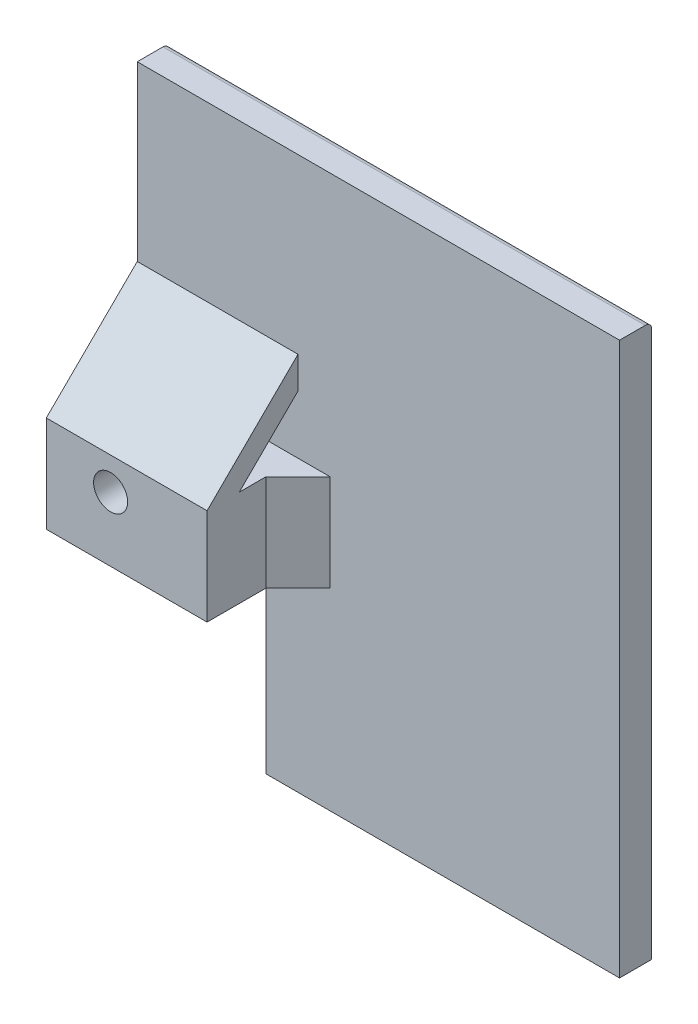
ISO-10303-21;
HEADER;
FILE_DESCRIPTION(('STEP AP214'),'2;1');
FILE_NAME('part.step','',(''),(''),'','','');
FILE_SCHEMA(('AUTOMOTIVE_DESIGN { 1 0 10303 214 1 1 1 1 }'));
ENDSEC;
DATA;
#1=APPLICATION_CONTEXT('core data for automotive mechanical design processes');
#2=APPLICATION_PROTOCOL_DEFINITION('international standard','automotive_design',2000,#1);
#3=PRODUCT_CONTEXT('',#1,'mechanical');
#4=PRODUCT('Part','Part','',(#3));
#5=PRODUCT_RELATED_PRODUCT_CATEGORY('part','',(#4));
#6=PRODUCT_DEFINITION_FORMATION('','',#4);
#7=PRODUCT_DEFINITION_CONTEXT('part definition',#1,'design');
#8=PRODUCT_DEFINITION('design','',#6,#7);
#9=PRODUCT_DEFINITION_SHAPE('','',#8);
#10=(LENGTH_UNIT() NAMED_UNIT(*) SI_UNIT(.MILLI.,.METRE.));
#11=(NAMED_UNIT(*) PLANE_ANGLE_UNIT() SI_UNIT($,.RADIAN.));
#12=(NAMED_UNIT(*) SI_UNIT($,.STERADIAN.) SOLID_ANGLE_UNIT());
#13=UNCERTAINTY_MEASURE_WITH_UNIT(LENGTH_MEASURE(1.E-05),#10,'distance_accuracy_value','');
#14=(GEOMETRIC_REPRESENTATION_CONTEXT(3) GLOBAL_UNCERTAINTY_ASSIGNED_CONTEXT((#13)) GLOBAL_UNIT_ASSIGNED_CONTEXT((#10,
#11,#12)) REPRESENTATION_CONTEXT('',''));
#15=CARTESIAN_POINT('',(0.,0.,0.));
#16=DIRECTION('',(0.,0.,1.));
#17=DIRECTION('',(1.,0.,0.));
#18=AXIS2_PLACEMENT_3D('',#15,#16,#17);
#19=CARTESIAN_POINT('',(0.,0.,5.));
#20=DIRECTION('',(0.,1.,0.));
#21=DIRECTION('',(0.,0.,1.));
#22=AXIS2_PLACEMENT_3D('',#19,#20,#21);
#23=PLANE('',#22);
#24=DIRECTION('',(-1.,0.,0.));
#25=VECTOR('',#24,1.);
#26=CARTESIAN_POINT('',(75.,0.,-9.14213562373095));
#27=LINE('',#26,#25);
#28=CARTESIAN_POINT('',(30.0000000000001,0.,-9.14213562373095));
#29=VERTEX_POINT('',#28);
#30=CARTESIAN_POINT('',(20.,0.,-9.14213562373096));
#31=VERTEX_POINT('',#30);
#32=EDGE_CURVE('E11',#29,#31,#27,.T.);
#33=ORIENTED_EDGE('',*,*,#32,.F.);
#34=DIRECTION('',(-0.707106781186552,0.,0.707106781186543));
#35=VECTOR('',#34,1.);
#36=CARTESIAN_POINT('',(7.92893218813437,0.,12.9289321881345));
#37=LINE('',#36,#35);
#38=CARTESIAN_POINT('',(25.,0.,-4.14213562373097));
#39=VERTEX_POINT('',#38);
#40=EDGE_CURVE('E279',#29,#39,#37,.T.);
#41=ORIENTED_EDGE('',*,*,#40,.T.);
#42=DIRECTION('',(0.,0.,-1.));
#43=VECTOR('',#42,1.);
#44=CARTESIAN_POINT('',(25.,0.,5.));
#45=LINE('',#44,#43);
#46=CARTESIAN_POINT('',(25.,0.,5.));
#47=VERTEX_POINT('',#46);
#48=EDGE_CURVE('E268',#47,#39,#45,.T.);
#49=ORIENTED_EDGE('',*,*,#48,.F.);
#50=DIRECTION('',(1.,0.,0.));
#51=VECTOR('',#50,1.);
#52=CARTESIAN_POINT('',(0.,0.,5.));
#53=LINE('',#52,#51);
#54=CARTESIAN_POINT('',(0.,0.,5.));
#55=VERTEX_POINT('',#54);
#56=EDGE_CURVE('E242',#55,#47,#53,.T.);
#57=ORIENTED_EDGE('',*,*,#56,.F.);
#58=DIRECTION('',(0.,0.,-1.));
#59=VECTOR('',#58,1.);
#60=CARTESIAN_POINT('',(0.,0.,5.));
#61=LINE('',#60,#59);
#62=CARTESIAN_POINT('',(0.,0.,0.));
#63=VERTEX_POINT('',#62);
#64=EDGE_CURVE('E254',#55,#63,#61,.T.);
#65=ORIENTED_EDGE('',*,*,#64,.T.);
#66=DIRECTION('',(1.,0.,0.));
#67=VECTOR('',#66,1.);
#68=CARTESIAN_POINT('',(0.,0.,0.));
#69=LINE('',#68,#67);
#70=CARTESIAN_POINT('',(20.,0.,0.));
#71=VERTEX_POINT('',#70);
#72=EDGE_CURVE('E257',#63,#71,#69,.T.);
#73=ORIENTED_EDGE('',*,*,#72,.T.);
#74=DIRECTION('',(0.,0.,1.));
#75=VECTOR('',#74,1.);
#76=CARTESIAN_POINT('',(20.,0.,-14.142135623731));
#77=LINE('',#76,#75);
#78=EDGE_CURVE('E236',#31,#71,#77,.T.);
#79=ORIENTED_EDGE('',*,*,#78,.F.);
#80=EDGE_LOOP('',(#33,#41,#49,#57,#65,#73,#79));
#81=FACE_BOUND('',#80,.T.);
#82=ADVANCED_FACE('F45',(#81),#23,.F.);
#83=CARTESIAN_POINT('',(0.,0.,0.));
#84=DIRECTION('',(0.,0.,1.));
#85=DIRECTION('',(1.,0.,0.));
#86=AXIS2_PLACEMENT_3D('',#83,#84,#85);
#87=PLANE('',#86);
#88=CARTESIAN_POINT('',(10.,10.,0.));
#89=DIRECTION('',(0.,0.,1.));
#90=DIRECTION('',(1.,0.,0.));
#91=AXIS2_PLACEMENT_3D('',#88,#89,#90);
#92=CIRCLE('',#91,2.65);
#93=CARTESIAN_POINT('',(12.65,10.,0.));
#94=VERTEX_POINT('',#93);
#95=EDGE_CURVE('E238',#94,#94,#92,.T.);
#96=ORIENTED_EDGE('',*,*,#95,.T.);
#97=EDGE_LOOP('',(#96));
#98=FACE_BOUND('',#97,.T.);
#99=DIRECTION('',(0.,1.,0.));
#100=VECTOR('',#99,1.);
#101=CARTESIAN_POINT('',(20.,15.,0.));
#102=LINE('',#101,#100);
#103=CARTESIAN_POINT('',(20.,15.,0.));
#104=VERTEX_POINT('',#103);
#105=EDGE_CURVE('E166',#71,#104,#102,.T.);
#106=ORIENTED_EDGE('',*,*,#105,.F.);
#107=ORIENTED_EDGE('',*,*,#72,.F.);
#108=DIRECTION('',(0.,1.,0.));
#109=VECTOR('',#108,1.);
#110=CARTESIAN_POINT('',(0.,0.,0.));
#111=LINE('',#110,#109);
#112=CARTESIAN_POINT('',(0.,15.,0.));
#113=VERTEX_POINT('',#112);
#114=EDGE_CURVE('E243',#63,#113,#111,.T.);
#115=ORIENTED_EDGE('',*,*,#114,.T.);
#116=DIRECTION('',(1.,0.,0.));
#117=VECTOR('',#116,1.);
#118=CARTESIAN_POINT('',(0.,15.,0.));
#119=LINE('',#118,#117);
#120=EDGE_CURVE('E260',#113,#104,#119,.T.);
#121=ORIENTED_EDGE('',*,*,#120,.T.);
#122=EDGE_LOOP('',(#106,#107,#115,#121));
#123=FACE_BOUND('',#122,.T.);
#124=ADVANCED_FACE('F303',(#98,#123),#87,.F.);
#125=CARTESIAN_POINT('',(25.,0.,5.));
#126=DIRECTION('',(1.,0.,0.));
#127=DIRECTION('',(0.,1.,0.));
#128=AXIS2_PLACEMENT_3D('',#125,#126,#127);
#129=PLANE('',#128);
#130=ORIENTED_EDGE('',*,*,#48,.T.);
#131=DIRECTION('',(0.,1.,0.));
#132=VECTOR('',#131,1.);
#133=CARTESIAN_POINT('',(25.,0.,-4.14213562373097));
#134=LINE('',#133,#132);
#135=CARTESIAN_POINT('',(25.,15.,-4.14213562373096));
#136=VERTEX_POINT('',#135);
#137=EDGE_CURVE('E277',#39,#136,#134,.T.);
#138=ORIENTED_EDGE('',*,*,#137,.T.);
#139=DIRECTION('',(0.,0.,-1.));
#140=VECTOR('',#139,1.);
#141=CARTESIAN_POINT('',(25.,15.,5.));
#142=LINE('',#141,#140);
#143=CARTESIAN_POINT('',(25.,15.,0.));
#144=VERTEX_POINT('',#143);
#145=EDGE_CURVE('E265',#144,#136,#142,.T.);
#146=ORIENTED_EDGE('',*,*,#145,.F.);
#147=DIRECTION('',(0.,-0.703526470681449,0.710669054518701));
#148=VECTOR('',#147,1.);
#149=CARTESIAN_POINT('',(25.,15.,0.));
#150=LINE('',#149,#148);
#151=CARTESIAN_POINT('',(25.,24.0502525316942,-9.14213562373095));
#152=VERTEX_POINT('',#151);
#153=EDGE_CURVE('E197',#152,#144,#150,.T.);
#154=ORIENTED_EDGE('',*,*,#153,.F.);
#155=DIRECTION('',(0.,-1.,0.));
#156=VECTOR('',#155,1.);
#157=CARTESIAN_POINT('',(25.,15.,-9.14213562373095));
#158=LINE('',#157,#156);
#159=CARTESIAN_POINT('',(25.,29.,-9.14213562373095));
#160=VERTEX_POINT('',#159);
#161=EDGE_CURVE('E271',#160,#152,#158,.T.);
#162=ORIENTED_EDGE('',*,*,#161,.F.);
#163=DIRECTION('',(0.,0.703526470681449,-0.710669054518701));
#164=VECTOR('',#163,1.);
#165=CARTESIAN_POINT('',(25.,29.,-9.14213562373095));
#166=LINE('',#165,#164);
#167=CARTESIAN_POINT('',(25.,15.,5.));
#168=VERTEX_POINT('',#167);
#169=EDGE_CURVE('E192',#168,#160,#166,.T.);
#170=ORIENTED_EDGE('',*,*,#169,.F.);
#171=DIRECTION('',(0.,-1.,0.));
#172=VECTOR('',#171,1.);
#173=CARTESIAN_POINT('',(25.,0.,5.));
#174=LINE('',#173,#172);
#175=EDGE_CURVE('E245',#168,#47,#174,.T.);
#176=ORIENTED_EDGE('',*,*,#175,.T.);
#177=EDGE_LOOP('',(#130,#138,#146,#154,#162,#170,#176));
#178=FACE_BOUND('',#177,.T.);
#179=ADVANCED_FACE('F309',(#178),#129,.T.);
#180=CARTESIAN_POINT('',(0.,15.,5.));
#181=DIRECTION('',(0.,1.,0.));
#182=DIRECTION('',(0.,0.,1.));
#183=AXIS2_PLACEMENT_3D('',#180,#181,#182);
#184=PLANE('',#183);
#185=DIRECTION('',(-1.,0.,0.));
#186=VECTOR('',#185,1.);
#187=CARTESIAN_POINT('',(48.7154244372162,15.,0.));
#188=LINE('',#187,#186);
#189=EDGE_CURVE('E200',#144,#104,#188,.T.);
#190=ORIENTED_EDGE('',*,*,#189,.F.);
#191=ORIENTED_EDGE('',*,*,#145,.T.);
#192=DIRECTION('',(0.707106781186552,0.,-0.707106781186543));
#193=VECTOR('',#192,1.);
#194=CARTESIAN_POINT('',(30.,15.,-9.14213562373095));
#195=LINE('',#194,#193);
#196=CARTESIAN_POINT('',(30.,15.,-9.14213562373095));
#197=VERTEX_POINT('',#196);
#198=EDGE_CURVE('E281',#136,#197,#195,.T.);
#199=ORIENTED_EDGE('',*,*,#198,.T.);
#200=DIRECTION('',(1.,0.,0.));
#201=VECTOR('',#200,1.);
#202=CARTESIAN_POINT('',(20.,15.,-9.14213562373095));
#203=LINE('',#202,#201);
#204=CARTESIAN_POINT('',(20.,15.,-9.14213562373095));
#205=VERTEX_POINT('',#204);
#206=EDGE_CURVE('E221',#205,#197,#203,.T.);
#207=ORIENTED_EDGE('',*,*,#206,.F.);
#208=DIRECTION('',(0.,0.,1.));
#209=VECTOR('',#208,1.);
#210=CARTESIAN_POINT('',(20.,15.,-14.142135623731));
#211=LINE('',#210,#209);
#212=EDGE_CURVE('E232',#205,#104,#211,.T.);
#213=ORIENTED_EDGE('',*,*,#212,.T.);
#214=EDGE_LOOP('',(#190,#191,#199,#207,#213));
#215=FACE_BOUND('',#214,.T.);
#216=ADVANCED_FACE('F318',(#215),#184,.T.);
#217=CARTESIAN_POINT('',(10.,10.,5.));
#218=DIRECTION('',(0.,0.,-1.));
#219=DIRECTION('',(-1.,0.,0.));
#220=AXIS2_PLACEMENT_3D('',#217,#218,#219);
#221=CYLINDRICAL_SURFACE('',#220,2.65);
#222=CARTESIAN_POINT('',(10.,10.,5.));
#223=DIRECTION('',(0.,0.,1.));
#224=DIRECTION('',(1.,0.,0.));
#225=AXIS2_PLACEMENT_3D('',#222,#223,#224);
#226=CIRCLE('',#225,2.65);
#227=CARTESIAN_POINT('',(12.65,10.,5.));
#228=VERTEX_POINT('',#227);
#229=EDGE_CURVE('E239',#228,#228,#226,.T.);
#230=ORIENTED_EDGE('',*,*,#229,.T.);
#231=EDGE_LOOP('',(#230));
#232=FACE_BOUND('',#231,.T.);
#233=ORIENTED_EDGE('',*,*,#95,.F.);
#234=EDGE_LOOP('',(#233));
#235=FACE_BOUND('',#234,.T.);
#236=ADVANCED_FACE('F315',(#232,#235),#221,.F.);
#237=CARTESIAN_POINT('',(0.,0.,5.));
#238=DIRECTION('',(-1.,0.,0.));
#239=DIRECTION('',(0.,-1.,0.));
#240=AXIS2_PLACEMENT_3D('',#237,#238,#239);
#241=PLANE('',#240);
#242=DIRECTION('',(0.,0.,-1.));
#243=VECTOR('',#242,1.);
#244=CARTESIAN_POINT('',(0.,55.9,-9.14213562373095));
#245=LINE('',#244,#243);
#246=CARTESIAN_POINT('',(0.,55.9,-9.14213562373095));
#247=VERTEX_POINT('',#246);
#248=CARTESIAN_POINT('',(0.,55.9,-13.142135623731));
#249=VERTEX_POINT('',#248);
#250=EDGE_CURVE('E216',#247,#249,#245,.T.);
#251=ORIENTED_EDGE('',*,*,#250,.T.);
#252=CARTESIAN_POINT('',(0.,54.9,-13.142135623731));
#253=DIRECTION('',(-1.,0.,0.));
#254=DIRECTION('',(0.,-1.,0.));
#255=AXIS2_PLACEMENT_3D('',#252,#253,#254);
#256=CIRCLE('',#255,1.);
#257=CARTESIAN_POINT('',(0.,54.9,-14.142135623731));
#258=VERTEX_POINT('',#257);
#259=EDGE_CURVE('E69',#249,#258,#256,.T.);
#260=ORIENTED_EDGE('',*,*,#259,.T.);
#261=DIRECTION('',(0.,1.,0.));
#262=VECTOR('',#261,1.);
#263=CARTESIAN_POINT('',(0.,29.,-14.142135623731));
#264=LINE('',#263,#262);
#265=CARTESIAN_POINT('',(0.,29.,-14.142135623731));
#266=VERTEX_POINT('',#265);
#267=EDGE_CURVE('E213',#266,#258,#264,.T.);
#268=ORIENTED_EDGE('',*,*,#267,.F.);
#269=DIRECTION('',(0.,-0.703526470681449,0.710669054518701));
#270=VECTOR('',#269,1.);
#271=CARTESIAN_POINT('',(0.,15.,0.));
#272=LINE('',#271,#270);
#273=EDGE_CURVE('E189',#266,#113,#272,.T.);
#274=ORIENTED_EDGE('',*,*,#273,.T.);
#275=ORIENTED_EDGE('',*,*,#114,.F.);
#276=ORIENTED_EDGE('',*,*,#64,.F.);
#277=DIRECTION('',(0.,1.,0.));
#278=VECTOR('',#277,1.);
#279=CARTESIAN_POINT('',(0.,0.,5.));
#280=LINE('',#279,#278);
#281=CARTESIAN_POINT('',(0.,15.,5.));
#282=VERTEX_POINT('',#281);
#283=EDGE_CURVE('E251',#55,#282,#280,.T.);
#284=ORIENTED_EDGE('',*,*,#283,.T.);
#285=DIRECTION('',(0.,0.703526470681449,-0.710669054518701));
#286=VECTOR('',#285,1.);
#287=CARTESIAN_POINT('',(0.,29.,-9.14213562373095));
#288=LINE('',#287,#286);
#289=CARTESIAN_POINT('',(0.,29.,-9.14213562373095));
#290=VERTEX_POINT('',#289);
#291=EDGE_CURVE('E188',#282,#290,#288,.T.);
#292=ORIENTED_EDGE('',*,*,#291,.T.);
#293=DIRECTION('',(0.,1.,0.));
#294=VECTOR('',#293,1.);
#295=CARTESIAN_POINT('',(0.,29.,-9.14213562373095));
#296=LINE('',#295,#294);
#297=EDGE_CURVE('E212',#290,#247,#296,.T.);
#298=ORIENTED_EDGE('',*,*,#297,.T.);
#299=EDGE_LOOP('',(#251,#260,#268,#274,#275,#276,#284,#292,#298));
#300=FACE_BOUND('',#299,.T.);
#301=ADVANCED_FACE('F317',(#300),#241,.T.);
#302=CARTESIAN_POINT('',(0.,0.,5.));
#303=DIRECTION('',(0.,0.,1.));
#304=DIRECTION('',(1.,0.,0.));
#305=AXIS2_PLACEMENT_3D('',#302,#303,#304);
#306=PLANE('',#305);
#307=ORIENTED_EDGE('',*,*,#229,.F.);
#308=EDGE_LOOP('',(#307));
#309=FACE_BOUND('',#308,.T.);
#310=ORIENTED_EDGE('',*,*,#56,.T.);
#311=ORIENTED_EDGE('',*,*,#175,.F.);
#312=DIRECTION('',(1.,0.,0.));
#313=VECTOR('',#312,1.);
#314=CARTESIAN_POINT('',(0.,15.,5.));
#315=LINE('',#314,#313);
#316=EDGE_CURVE('E248',#282,#168,#315,.T.);
#317=ORIENTED_EDGE('',*,*,#316,.F.);
#318=ORIENTED_EDGE('',*,*,#283,.F.);
#319=EDGE_LOOP('',(#310,#311,#317,#318));
#320=FACE_BOUND('',#319,.T.);
#321=ADVANCED_FACE('F327',(#309,#320),#306,.T.);
#322=CARTESIAN_POINT('',(20.,15.,-14.142135623731));
#323=DIRECTION('',(1.,0.,0.));
#324=DIRECTION('',(0.,0.,-1.));
#325=AXIS2_PLACEMENT_3D('',#322,#323,#324);
#326=PLANE('',#325);
#327=DIRECTION('',(0.,-1.,0.));
#328=VECTOR('',#327,1.);
#329=CARTESIAN_POINT('',(20.,55.9,-9.14213562373095));
#330=LINE('',#329,#328);
#331=CARTESIAN_POINT('',(20.,24.0502525316942,-9.14213562373095));
#332=VERTEX_POINT('',#331);
#333=EDGE_CURVE('E225',#332,#205,#330,.T.);
#334=ORIENTED_EDGE('',*,*,#333,.F.);
#335=DIRECTION('',(0.,0.703526470681449,-0.710669054518701));
#336=VECTOR('',#335,1.);
#337=CARTESIAN_POINT('',(20.,22.0707070707071,-7.14249273925805));
#338=LINE('',#337,#336);
#339=CARTESIAN_POINT('',(20.,29.,-14.142135623731));
#340=VERTEX_POINT('',#339);
#341=EDGE_CURVE('E206',#332,#340,#338,.T.);
#342=ORIENTED_EDGE('',*,*,#341,.T.);
#343=DIRECTION('',(0.,1.,0.));
#344=VECTOR('',#343,1.);
#345=CARTESIAN_POINT('',(20.,15.,-14.142135623731));
#346=LINE('',#345,#344);
#347=CARTESIAN_POINT('',(20.,-30.,-14.142135623731));
#348=VERTEX_POINT('',#347);
#349=EDGE_CURVE('E229',#348,#340,#346,.T.);
#350=ORIENTED_EDGE('',*,*,#349,.F.);
#351=DIRECTION('',(0.,0.,-1.));
#352=VECTOR('',#351,1.);
#353=CARTESIAN_POINT('',(20.,-30.,-14.142135623731));
#354=LINE('',#353,#352);
#355=CARTESIAN_POINT('',(20.,-30.,-9.14213562373096));
#356=VERTEX_POINT('',#355);
#357=EDGE_CURVE('E177',#356,#348,#354,.T.);
#358=ORIENTED_EDGE('',*,*,#357,.F.);
#359=DIRECTION('',(0.,1.,0.));
#360=VECTOR('',#359,1.);
#361=CARTESIAN_POINT('',(20.,-30.,-9.14213562373096));
#362=LINE('',#361,#360);
#363=EDGE_CURVE('E173',#356,#31,#362,.T.);
#364=ORIENTED_EDGE('',*,*,#363,.T.);
#365=ORIENTED_EDGE('',*,*,#78,.T.);
#366=ORIENTED_EDGE('',*,*,#105,.T.);
#367=ORIENTED_EDGE('',*,*,#212,.F.);
#368=EDGE_LOOP('',(#334,#342,#350,#358,#364,#365,#366,#367));
#369=FACE_BOUND('',#368,.T.);
#370=ADVANCED_FACE('F356',(#369),#326,.F.);
#371=CARTESIAN_POINT('',(0.,0.,-14.142135623731));
#372=DIRECTION('',(0.,0.,-1.));
#373=DIRECTION('',(-1.,0.,0.));
#374=AXIS2_PLACEMENT_3D('',#371,#372,#373);
#375=PLANE('',#374);
#376=ORIENTED_EDGE('',*,*,#267,.T.);
#377=DIRECTION('',(-1.,0.,0.));
#378=VECTOR('',#377,1.);
#379=CARTESIAN_POINT('',(75.,54.9,-14.142135623731));
#380=LINE('',#379,#378);
#381=CARTESIAN_POINT('',(75.,54.9,-14.142135623731));
#382=VERTEX_POINT('',#381);
#383=EDGE_CURVE('E61',#258,#382,#380,.F.);
#384=ORIENTED_EDGE('',*,*,#383,.T.);
#385=DIRECTION('',(0.,1.,0.));
#386=VECTOR('',#385,1.);
#387=CARTESIAN_POINT('',(75.,15.,-14.142135623731));
#388=LINE('',#387,#386);
#389=CARTESIAN_POINT('',(75.,-30.,-14.142135623731));
#390=VERTEX_POINT('',#389);
#391=EDGE_CURVE('E167',#390,#382,#388,.T.);
#392=ORIENTED_EDGE('',*,*,#391,.F.);
#393=DIRECTION('',(1.,0.,0.));
#394=VECTOR('',#393,1.);
#395=CARTESIAN_POINT('',(75.,-30.,-14.142135623731));
#396=LINE('',#395,#394);
#397=EDGE_CURVE('E182',#348,#390,#396,.T.);
#398=ORIENTED_EDGE('',*,*,#397,.F.);
#399=ORIENTED_EDGE('',*,*,#349,.T.);
#400=DIRECTION('',(-1.,0.,0.));
#401=VECTOR('',#400,1.);
#402=CARTESIAN_POINT('',(20.,29.,-14.142135623731));
#403=LINE('',#402,#401);
#404=EDGE_CURVE('E209',#340,#266,#403,.T.);
#405=ORIENTED_EDGE('',*,*,#404,.T.);
#406=EDGE_LOOP('',(#376,#384,#392,#398,#399,#405));
#407=FACE_BOUND('',#406,.T.);
#408=ADVANCED_FACE('F357',(#407),#375,.T.);
#409=CARTESIAN_POINT('',(75.,15.,-9.14213562373095));
#410=DIRECTION('',(0.,0.,-1.));
#411=DIRECTION('',(0.,1.,0.));
#412=AXIS2_PLACEMENT_3D('',#409,#410,#411);
#413=PLANE('',#412);
#414=ORIENTED_EDGE('',*,*,#206,.T.);
#415=DIRECTION('',(0.,-1.,0.));
#416=VECTOR('',#415,1.);
#417=CARTESIAN_POINT('',(30.,15.,-9.14213562373095));
#418=LINE('',#417,#416);
#419=EDGE_CURVE('E274',#197,#29,#418,.T.);
#420=ORIENTED_EDGE('',*,*,#419,.T.);
#421=ORIENTED_EDGE('',*,*,#32,.T.);
#422=ORIENTED_EDGE('',*,*,#363,.F.);
#423=DIRECTION('',(-1.,0.,0.));
#424=VECTOR('',#423,1.);
#425=CARTESIAN_POINT('',(75.,-30.,-9.14213562373095));
#426=LINE('',#425,#424);
#427=CARTESIAN_POINT('',(75.,-30.,-9.14213562373095));
#428=VERTEX_POINT('',#427);
#429=EDGE_CURVE('E170',#428,#356,#426,.T.);
#430=ORIENTED_EDGE('',*,*,#429,.F.);
#431=DIRECTION('',(0.,-1.,0.));
#432=VECTOR('',#431,1.);
#433=CARTESIAN_POINT('',(75.,15.,-9.14213562373095));
#434=LINE('',#433,#432);
#435=CARTESIAN_POINT('',(75.,55.9,-9.14213562373095));
#436=VERTEX_POINT('',#435);
#437=EDGE_CURVE('E157',#436,#428,#434,.T.);
#438=ORIENTED_EDGE('',*,*,#437,.F.);
#439=DIRECTION('',(1.,0.,0.));
#440=VECTOR('',#439,1.);
#441=CARTESIAN_POINT('',(20.,55.9,-9.14213562373095));
#442=LINE('',#441,#440);
#443=EDGE_CURVE('E222',#247,#436,#442,.T.);
#444=ORIENTED_EDGE('',*,*,#443,.F.);
#445=ORIENTED_EDGE('',*,*,#297,.F.);
#446=DIRECTION('',(-1.,0.,0.));
#447=VECTOR('',#446,1.);
#448=CARTESIAN_POINT('',(20.,29.,-9.14213562373095));
#449=LINE('',#448,#447);
#450=EDGE_CURVE('E210',#160,#290,#449,.T.);
#451=ORIENTED_EDGE('',*,*,#450,.F.);
#452=ORIENTED_EDGE('',*,*,#161,.T.);
#453=DIRECTION('',(-1.,0.,0.));
#454=VECTOR('',#453,1.);
#455=CARTESIAN_POINT('',(75.,24.0502525316942,-9.14213562373095));
#456=LINE('',#455,#454);
#457=EDGE_CURVE('E203',#152,#332,#456,.T.);
#458=ORIENTED_EDGE('',*,*,#457,.T.);
#459=ORIENTED_EDGE('',*,*,#333,.T.);
#460=EDGE_LOOP('',(#414,#420,#421,#422,#430,#438,#444,#445,#451,#452,#458,#459));
#461=FACE_BOUND('',#460,.T.);
#462=ADVANCED_FACE('F171',(#461),#413,.F.);
#463=CARTESIAN_POINT('',(75.,0.,0.));
#464=DIRECTION('',(-1.,0.,0.));
#465=DIRECTION('',(0.,-1.,0.));
#466=AXIS2_PLACEMENT_3D('',#463,#464,#465);
#467=PLANE('',#466);
#468=ORIENTED_EDGE('',*,*,#391,.T.);
#469=CARTESIAN_POINT('',(75.,54.9,-13.142135623731));
#470=DIRECTION('',(-1.,0.,0.));
#471=DIRECTION('',(0.,-1.,0.));
#472=AXIS2_PLACEMENT_3D('',#469,#470,#471);
#473=CIRCLE('',#472,1.);
#474=CARTESIAN_POINT('',(75.,55.9,-13.142135623731));
#475=VERTEX_POINT('',#474);
#476=EDGE_CURVE('E49',#382,#475,#473,.F.);
#477=ORIENTED_EDGE('',*,*,#476,.T.);
#478=DIRECTION('',(0.,0.,-1.));
#479=VECTOR('',#478,1.);
#480=CARTESIAN_POINT('',(75.,55.9,-9.14213562373095));
#481=LINE('',#480,#479);
#482=EDGE_CURVE('E163',#436,#475,#481,.T.);
#483=ORIENTED_EDGE('',*,*,#482,.F.);
#484=ORIENTED_EDGE('',*,*,#437,.T.);
#485=DIRECTION('',(0.,0.,1.));
#486=VECTOR('',#485,1.);
#487=CARTESIAN_POINT('',(75.,-30.,-14.142135623731));
#488=LINE('',#487,#486);
#489=EDGE_CURVE('E161',#390,#428,#488,.T.);
#490=ORIENTED_EDGE('',*,*,#489,.F.);
#491=EDGE_LOOP('',(#468,#477,#483,#484,#490));
#492=FACE_BOUND('',#491,.T.);
#493=ADVANCED_FACE('F159',(#492),#467,.F.);
#494=CARTESIAN_POINT('',(0.,55.9,0.));
#495=DIRECTION('',(0.,-1.,0.));
#496=DIRECTION('',(0.,0.,-1.));
#497=AXIS2_PLACEMENT_3D('',#494,#495,#496);
#498=PLANE('',#497);
#499=ORIENTED_EDGE('',*,*,#482,.T.);
#500=DIRECTION('',(-1.,0.,0.));
#501=VECTOR('',#500,1.);
#502=CARTESIAN_POINT('',(0.,55.9,-13.142135623731));
#503=LINE('',#502,#501);
#504=EDGE_CURVE('E284',#475,#249,#503,.T.);
#505=ORIENTED_EDGE('',*,*,#504,.T.);
#506=ORIENTED_EDGE('',*,*,#250,.F.);
#507=ORIENTED_EDGE('',*,*,#443,.T.);
#508=EDGE_LOOP('',(#499,#505,#506,#507));
#509=FACE_BOUND('',#508,.T.);
#510=ADVANCED_FACE('F291',(#509),#498,.F.);
#511=CARTESIAN_POINT('',(48.7154244372162,15.,0.));
#512=DIRECTION('',(0.,-0.710669054518701,-0.703526470681449));
#513=DIRECTION('',(0.,0.703526470681449,-0.710669054518701));
#514=AXIS2_PLACEMENT_3D('',#511,#512,#513);
#515=PLANE('',#514);
#516=ORIENTED_EDGE('',*,*,#341,.F.);
#517=ORIENTED_EDGE('',*,*,#457,.F.);
#518=ORIENTED_EDGE('',*,*,#153,.T.);
#519=ORIENTED_EDGE('',*,*,#189,.T.);
#520=ORIENTED_EDGE('',*,*,#120,.F.);
#521=ORIENTED_EDGE('',*,*,#273,.F.);
#522=ORIENTED_EDGE('',*,*,#404,.F.);
#523=EDGE_LOOP('',(#516,#517,#518,#519,#520,#521,#522));
#524=FACE_BOUND('',#523,.T.);
#525=ADVANCED_FACE('F345',(#524),#515,.T.);
#526=CARTESIAN_POINT('',(48.7154244372162,29.,-9.14213562373095));
#527=DIRECTION('',(0.,0.710669054518701,0.703526470681449));
#528=DIRECTION('',(0.,-0.703526470681449,0.710669054518701));
#529=AXIS2_PLACEMENT_3D('',#526,#527,#528);
#530=PLANE('',#529);
#531=ORIENTED_EDGE('',*,*,#316,.T.);
#532=ORIENTED_EDGE('',*,*,#169,.T.);
#533=ORIENTED_EDGE('',*,*,#450,.T.);
#534=ORIENTED_EDGE('',*,*,#291,.F.);
#535=EDGE_LOOP('',(#531,#532,#533,#534));
#536=FACE_BOUND('',#535,.T.);
#537=ADVANCED_FACE('F300',(#536),#530,.T.);
#538=CARTESIAN_POINT('',(30.,15.,-9.14213562373095));
#539=DIRECTION('',(-0.707106781186543,0.,-0.707106781186552));
#540=DIRECTION('',(0.,-1.,0.));
#541=AXIS2_PLACEMENT_3D('',#538,#539,#540);
#542=PLANE('',#541);
#543=ORIENTED_EDGE('',*,*,#198,.F.);
#544=ORIENTED_EDGE('',*,*,#137,.F.);
#545=ORIENTED_EDGE('',*,*,#40,.F.);
#546=ORIENTED_EDGE('',*,*,#419,.F.);
#547=EDGE_LOOP('',(#543,#544,#545,#546));
#548=FACE_BOUND('',#547,.T.);
#549=ADVANCED_FACE('F294',(#548),#542,.F.);
#550=CARTESIAN_POINT('',(0.,54.9,-13.142135623731));
#551=DIRECTION('',(1.,0.,0.));
#552=DIRECTION('',(0.,0.,-1.));
#553=AXIS2_PLACEMENT_3D('',#550,#551,#552);
#554=CYLINDRICAL_SURFACE('',#553,1.);
#555=ORIENTED_EDGE('',*,*,#476,.F.);
#556=ORIENTED_EDGE('',*,*,#383,.F.);
#557=ORIENTED_EDGE('',*,*,#259,.F.);
#558=ORIENTED_EDGE('',*,*,#504,.F.);
#559=EDGE_LOOP('',(#555,#556,#557,#558));
#560=FACE_BOUND('',#559,.T.);
#561=ADVANCED_FACE('F47',(#560),#554,.T.);
#562=CARTESIAN_POINT('',(0.,-30.,0.));
#563=DIRECTION('',(0.,-1.,0.));
#564=DIRECTION('',(0.,0.,-1.));
#565=AXIS2_PLACEMENT_3D('',#562,#563,#564);
#566=PLANE('',#565);
#567=ORIENTED_EDGE('',*,*,#489,.T.);
#568=ORIENTED_EDGE('',*,*,#429,.T.);
#569=ORIENTED_EDGE('',*,*,#357,.T.);
#570=ORIENTED_EDGE('',*,*,#397,.T.);
#571=EDGE_LOOP('',(#567,#568,#569,#570));
#572=FACE_BOUND('',#571,.T.);
#573=ADVANCED_FACE('F180',(#572),#566,.T.);
#574=CLOSED_SHELL('',(#82,#124,#179,#216,#236,#301,#321,#370,#408,#462,#493,#510,#525,#537,#549,
#561,#573));
#575=MANIFOLD_SOLID_BREP('B2',#574);
#576=ADVANCED_BREP_SHAPE_REPRESENTATION('',(#18,#575),#14);
#577=SHAPE_DEFINITION_REPRESENTATION(#9,#576);
ENDSEC;
END-ISO-10303-21;
